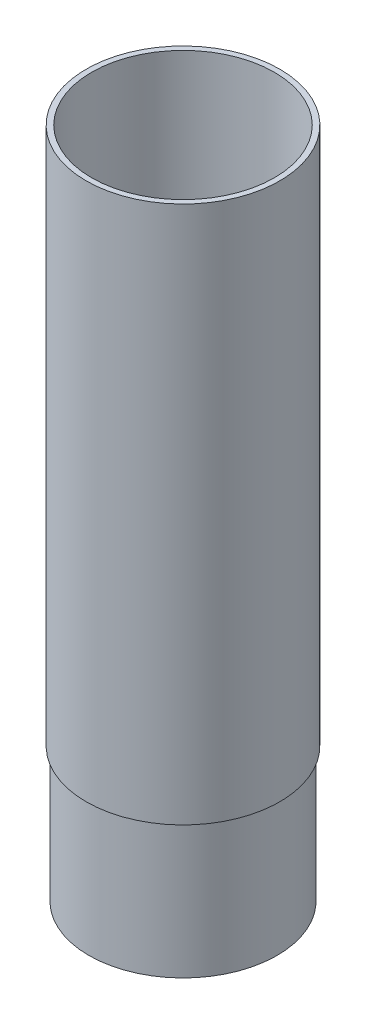
ISO-10303-21;
HEADER;
FILE_DESCRIPTION(('STEP AP214'),'2;1');
FILE_NAME('part.step','',(''),(''),'','','');
FILE_SCHEMA(('AUTOMOTIVE_DESIGN { 1 0 10303 214 1 1 1 1 }'));
ENDSEC;
DATA;
#1=APPLICATION_CONTEXT('core data for automotive mechanical design processes');
#2=APPLICATION_PROTOCOL_DEFINITION('international standard','automotive_design',2000,#1);
#3=PRODUCT_CONTEXT('',#1,'mechanical');
#4=PRODUCT('Part','Part','',(#3));
#5=PRODUCT_RELATED_PRODUCT_CATEGORY('part','',(#4));
#6=PRODUCT_DEFINITION_FORMATION('','',#4);
#7=PRODUCT_DEFINITION_CONTEXT('part definition',#1,'design');
#8=PRODUCT_DEFINITION('design','',#6,#7);
#9=PRODUCT_DEFINITION_SHAPE('','',#8);
#10=(LENGTH_UNIT() NAMED_UNIT(*) SI_UNIT(.MILLI.,.METRE.));
#11=(NAMED_UNIT(*) PLANE_ANGLE_UNIT() SI_UNIT($,.RADIAN.));
#12=(NAMED_UNIT(*) SI_UNIT($,.STERADIAN.) SOLID_ANGLE_UNIT());
#13=UNCERTAINTY_MEASURE_WITH_UNIT(LENGTH_MEASURE(1.E-05),#10,'distance_accuracy_value','');
#14=(GEOMETRIC_REPRESENTATION_CONTEXT(3) GLOBAL_UNCERTAINTY_ASSIGNED_CONTEXT((#13)) GLOBAL_UNIT_ASSIGNED_CONTEXT((#10,
#11,#12)) REPRESENTATION_CONTEXT('',''));
#15=CARTESIAN_POINT('',(0.,0.,0.));
#16=DIRECTION('',(0.,0.,1.));
#17=DIRECTION('',(1.,0.,0.));
#18=AXIS2_PLACEMENT_3D('',#15,#16,#17);
#19=CARTESIAN_POINT('',(0.,250.,0.));
#20=DIRECTION('',(0.,-1.,0.));
#21=DIRECTION('',(0.,0.,-1.));
#22=AXIS2_PLACEMENT_3D('',#19,#20,#21);
#23=CYLINDRICAL_SURFACE('',#22,35.);
#24=CARTESIAN_POINT('',(0.,0.,0.));
#25=DIRECTION('',(0.,1.,0.));
#26=DIRECTION('',(0.,0.,1.));
#27=AXIS2_PLACEMENT_3D('',#24,#25,#26);
#28=CIRCLE('',#27,35.);
#29=CARTESIAN_POINT('',(0.,0.,35.));
#30=VERTEX_POINT('',#29);
#31=EDGE_CURVE('E34',#30,#30,#28,.T.);
#32=ORIENTED_EDGE('',*,*,#31,.T.);
#33=EDGE_LOOP('',(#32));
#34=FACE_BOUND('',#33,.T.);
#35=CARTESIAN_POINT('',(0.,50.,0.));
#36=DIRECTION('',(0.,1.,0.));
#37=DIRECTION('',(0.,0.,1.));
#38=AXIS2_PLACEMENT_3D('',#35,#36,#37);
#39=CIRCLE('',#38,35.);
#40=CARTESIAN_POINT('',(0.,50.,35.));
#41=VERTEX_POINT('',#40);
#42=EDGE_CURVE('E10',#41,#41,#39,.T.);
#43=ORIENTED_EDGE('',*,*,#42,.F.);
#44=EDGE_LOOP('',(#43));
#45=FACE_BOUND('',#44,.T.);
#46=ADVANCED_FACE('F31',(#34,#45),#23,.T.);
#47=CARTESIAN_POINT('',(0.,0.,0.));
#48=DIRECTION('',(0.,1.,0.));
#49=DIRECTION('',(0.,0.,1.));
#50=AXIS2_PLACEMENT_3D('',#47,#48,#49);
#51=CYLINDRICAL_SURFACE('',#50,34.);
#52=CARTESIAN_POINT('',(0.,0.,0.));
#53=DIRECTION('',(0.,1.,0.));
#54=DIRECTION('',(0.,0.,1.));
#55=AXIS2_PLACEMENT_3D('',#52,#53,#54);
#56=CIRCLE('',#55,34.);
#57=CARTESIAN_POINT('',(0.,0.,34.));
#58=VERTEX_POINT('',#57);
#59=EDGE_CURVE('E42',#58,#58,#56,.T.);
#60=ORIENTED_EDGE('',*,*,#59,.F.);
#61=EDGE_LOOP('',(#60));
#62=FACE_BOUND('',#61,.T.);
#63=CARTESIAN_POINT('',(0.,250.,0.));
#64=DIRECTION('',(0.,1.,0.));
#65=DIRECTION('',(0.,0.,1.));
#66=AXIS2_PLACEMENT_3D('',#63,#64,#65);
#67=CIRCLE('',#66,34.);
#68=CARTESIAN_POINT('',(0.,250.,34.));
#69=VERTEX_POINT('',#68);
#70=EDGE_CURVE('E54',#69,#69,#67,.T.);
#71=ORIENTED_EDGE('',*,*,#70,.T.);
#72=EDGE_LOOP('',(#71));
#73=FACE_BOUND('',#72,.T.);
#74=ADVANCED_FACE('F59',(#62,#73),#51,.F.);
#75=CARTESIAN_POINT('',(0.,0.,0.));
#76=DIRECTION('',(0.,1.,0.));
#77=DIRECTION('',(0.,0.,1.));
#78=AXIS2_PLACEMENT_3D('',#75,#76,#77);
#79=PLANE('',#78);
#80=ORIENTED_EDGE('',*,*,#59,.T.);
#81=EDGE_LOOP('',(#80));
#82=FACE_BOUND('',#81,.T.);
#83=ORIENTED_EDGE('',*,*,#31,.F.);
#84=EDGE_LOOP('',(#83));
#85=FACE_BOUND('',#84,.T.);
#86=ADVANCED_FACE('F74',(#82,#85),#79,.F.);
#87=CARTESIAN_POINT('',(0.,50.,0.));
#88=DIRECTION('',(0.,1.,0.));
#89=DIRECTION('',(0.,0.,1.));
#90=AXIS2_PLACEMENT_3D('',#87,#88,#89);
#91=PLANE('',#90);
#92=CARTESIAN_POINT('',(0.,50.,0.));
#93=DIRECTION('',(0.,1.,0.));
#94=DIRECTION('',(0.,0.,1.));
#95=AXIS2_PLACEMENT_3D('',#92,#93,#94);
#96=CIRCLE('',#95,36.);
#97=CARTESIAN_POINT('',(0.,50.,36.));
#98=VERTEX_POINT('',#97);
#99=EDGE_CURVE('E47',#98,#98,#96,.T.);
#100=ORIENTED_EDGE('',*,*,#99,.F.);
#101=EDGE_LOOP('',(#100));
#102=FACE_BOUND('',#101,.T.);
#103=ORIENTED_EDGE('',*,*,#42,.T.);
#104=EDGE_LOOP('',(#103));
#105=FACE_BOUND('',#104,.T.);
#106=ADVANCED_FACE('F69',(#102,#105),#91,.F.);
#107=CARTESIAN_POINT('',(0.,50.,0.));
#108=DIRECTION('',(0.,1.,0.));
#109=DIRECTION('',(0.,0.,1.));
#110=AXIS2_PLACEMENT_3D('',#107,#108,#109);
#111=CYLINDRICAL_SURFACE('',#110,36.);
#112=ORIENTED_EDGE('',*,*,#99,.T.);
#113=EDGE_LOOP('',(#112));
#114=FACE_BOUND('',#113,.T.);
#115=CARTESIAN_POINT('',(0.,250.,0.));
#116=DIRECTION('',(0.,1.,0.));
#117=DIRECTION('',(0.,0.,1.));
#118=AXIS2_PLACEMENT_3D('',#115,#116,#117);
#119=CIRCLE('',#118,36.);
#120=CARTESIAN_POINT('',(0.,250.,36.));
#121=VERTEX_POINT('',#120);
#122=EDGE_CURVE('E44',#121,#121,#119,.T.);
#123=ORIENTED_EDGE('',*,*,#122,.F.);
#124=EDGE_LOOP('',(#123));
#125=FACE_BOUND('',#124,.T.);
#126=ADVANCED_FACE('F64',(#114,#125),#111,.T.);
#127=CARTESIAN_POINT('',(0.,250.,0.));
#128=DIRECTION('',(0.,1.,0.));
#129=DIRECTION('',(0.,0.,1.));
#130=AXIS2_PLACEMENT_3D('',#127,#128,#129);
#131=PLANE('',#130);
#132=ORIENTED_EDGE('',*,*,#70,.F.);
#133=EDGE_LOOP('',(#132));
#134=FACE_BOUND('',#133,.T.);
#135=ORIENTED_EDGE('',*,*,#122,.T.);
#136=EDGE_LOOP('',(#135));
#137=FACE_BOUND('',#136,.T.);
#138=ADVANCED_FACE('F61',(#134,#137),#131,.T.);
#139=CLOSED_SHELL('',(#46,#74,#86,#106,#126,#138));
#140=MANIFOLD_SOLID_BREP('B2',#139);
#141=ADVANCED_BREP_SHAPE_REPRESENTATION('',(#18,#140),#14);
#142=SHAPE_DEFINITION_REPRESENTATION(#9,#141);
ENDSEC;
END-ISO-10303-21;
